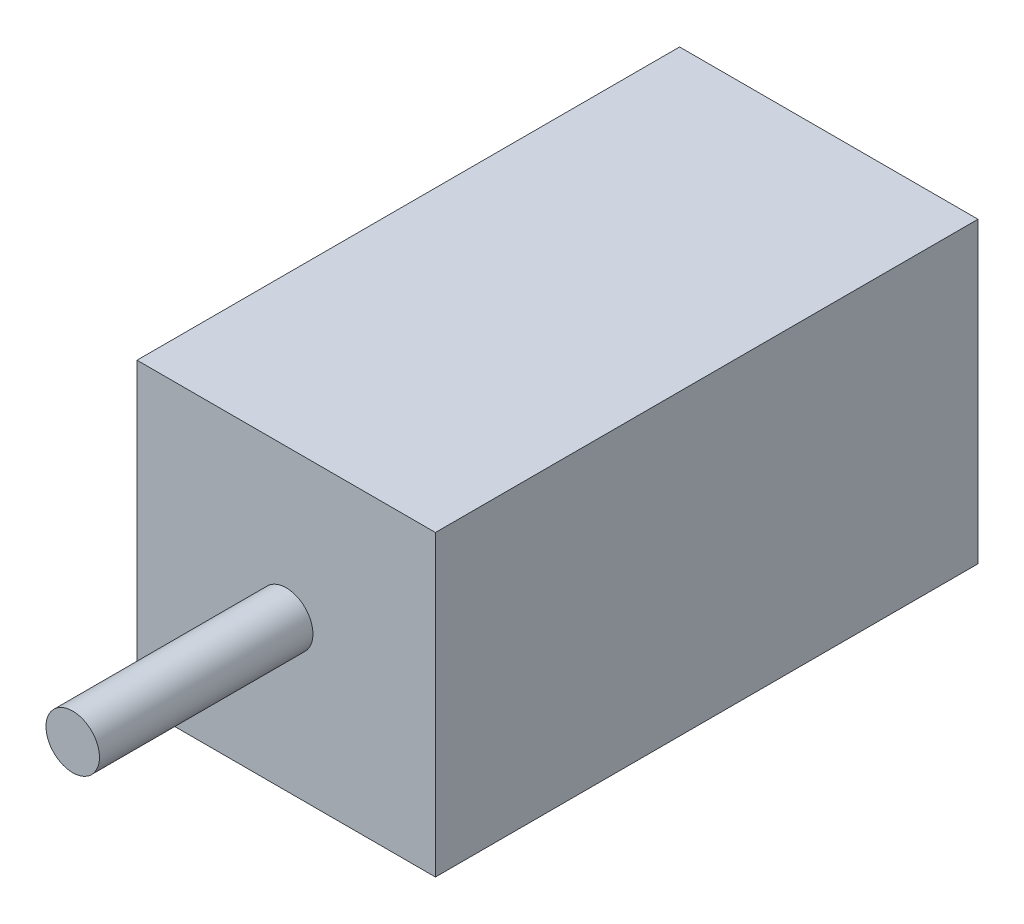
ISO-10303-21;
HEADER;
FILE_DESCRIPTION(('STEP AP214'),'2;1');
FILE_NAME('part.step','',(''),(''),'','','');
FILE_SCHEMA(('AUTOMOTIVE_DESIGN { 1 0 10303 214 1 1 1 1 }'));
ENDSEC;
DATA;
#1=APPLICATION_CONTEXT('core data for automotive mechanical design processes');
#2=APPLICATION_PROTOCOL_DEFINITION('international standard','automotive_design',2000,#1);
#3=PRODUCT_CONTEXT('',#1,'mechanical');
#4=PRODUCT('Part','Part','',(#3));
#5=PRODUCT_RELATED_PRODUCT_CATEGORY('part','',(#4));
#6=PRODUCT_DEFINITION_FORMATION('','',#4);
#7=PRODUCT_DEFINITION_CONTEXT('part definition',#1,'design');
#8=PRODUCT_DEFINITION('design','',#6,#7);
#9=PRODUCT_DEFINITION_SHAPE('','',#8);
#10=(LENGTH_UNIT() NAMED_UNIT(*) SI_UNIT(.MILLI.,.METRE.));
#11=(NAMED_UNIT(*) PLANE_ANGLE_UNIT() SI_UNIT($,.RADIAN.));
#12=(NAMED_UNIT(*) SI_UNIT($,.STERADIAN.) SOLID_ANGLE_UNIT());
#13=UNCERTAINTY_MEASURE_WITH_UNIT(LENGTH_MEASURE(1.E-05),#10,'distance_accuracy_value','');
#14=(GEOMETRIC_REPRESENTATION_CONTEXT(3) GLOBAL_UNCERTAINTY_ASSIGNED_CONTEXT((#13)) GLOBAL_UNIT_ASSIGNED_CONTEXT((#10,
#11,#12)) REPRESENTATION_CONTEXT('',''));
#15=CARTESIAN_POINT('',(0.,0.,0.));
#16=DIRECTION('',(0.,0.,1.));
#17=DIRECTION('',(1.,0.,0.));
#18=AXIS2_PLACEMENT_3D('',#15,#16,#17);
#19=CARTESIAN_POINT('',(13.97,-13.97,50.8));
#20=DIRECTION('',(-1.,0.,0.));
#21=DIRECTION('',(0.,0.,1.));
#22=AXIS2_PLACEMENT_3D('',#19,#20,#21);
#23=PLANE('',#22);
#24=DIRECTION('',(0.,1.,0.));
#25=VECTOR('',#24,1.);
#26=CARTESIAN_POINT('',(13.97,-13.97,0.));
#27=LINE('',#26,#25);
#28=CARTESIAN_POINT('',(13.97,-13.97,0.));
#29=VERTEX_POINT('',#28);
#30=CARTESIAN_POINT('',(13.97,13.97,0.));
#31=VERTEX_POINT('',#30);
#32=EDGE_CURVE('E99',#29,#31,#27,.T.);
#33=ORIENTED_EDGE('',*,*,#32,.T.);
#34=DIRECTION('',(0.,0.,-1.));
#35=VECTOR('',#34,1.);
#36=CARTESIAN_POINT('',(13.97,13.97,50.8));
#37=LINE('',#36,#35);
#38=CARTESIAN_POINT('',(13.97,13.97,50.8));
#39=VERTEX_POINT('',#38);
#40=EDGE_CURVE('E41',#39,#31,#37,.T.);
#41=ORIENTED_EDGE('',*,*,#40,.F.);
#42=DIRECTION('',(0.,1.,0.));
#43=VECTOR('',#42,1.);
#44=CARTESIAN_POINT('',(13.97,-13.97,50.8));
#45=LINE('',#44,#43);
#46=CARTESIAN_POINT('',(13.97,-13.97,50.8));
#47=VERTEX_POINT('',#46);
#48=EDGE_CURVE('E85',#47,#39,#45,.T.);
#49=ORIENTED_EDGE('',*,*,#48,.F.);
#50=DIRECTION('',(0.,0.,-1.));
#51=VECTOR('',#50,1.);
#52=CARTESIAN_POINT('',(13.97,-13.97,50.8));
#53=LINE('',#52,#51);
#54=EDGE_CURVE('E95',#47,#29,#53,.T.);
#55=ORIENTED_EDGE('',*,*,#54,.T.);
#56=EDGE_LOOP('',(#33,#41,#49,#55));
#57=FACE_BOUND('',#56,.T.);
#58=ADVANCED_FACE('F33',(#57),#23,.F.);
#59=CARTESIAN_POINT('',(-13.97,13.97,50.8));
#60=DIRECTION('',(0.,-1.,0.));
#61=DIRECTION('',(0.,0.,-1.));
#62=AXIS2_PLACEMENT_3D('',#59,#60,#61);
#63=PLANE('',#62);
#64=DIRECTION('',(-1.,0.,0.));
#65=VECTOR('',#64,1.);
#66=CARTESIAN_POINT('',(-13.97,13.97,0.));
#67=LINE('',#66,#65);
#68=CARTESIAN_POINT('',(-13.97,13.97,0.));
#69=VERTEX_POINT('',#68);
#70=EDGE_CURVE('E90',#31,#69,#67,.T.);
#71=ORIENTED_EDGE('',*,*,#70,.T.);
#72=DIRECTION('',(0.,0.,-1.));
#73=VECTOR('',#72,1.);
#74=CARTESIAN_POINT('',(-13.97,13.97,50.8));
#75=LINE('',#74,#73);
#76=CARTESIAN_POINT('',(-13.97,13.97,50.8));
#77=VERTEX_POINT('',#76);
#78=EDGE_CURVE('E88',#77,#69,#75,.T.);
#79=ORIENTED_EDGE('',*,*,#78,.F.);
#80=DIRECTION('',(-1.,0.,0.));
#81=VECTOR('',#80,1.);
#82=CARTESIAN_POINT('',(-13.97,13.97,50.8));
#83=LINE('',#82,#81);
#84=EDGE_CURVE('E80',#39,#77,#83,.T.);
#85=ORIENTED_EDGE('',*,*,#84,.F.);
#86=ORIENTED_EDGE('',*,*,#40,.T.);
#87=EDGE_LOOP('',(#71,#79,#85,#86));
#88=FACE_BOUND('',#87,.T.);
#89=ADVANCED_FACE('F89',(#88),#63,.F.);
#90=CARTESIAN_POINT('',(-13.97,-13.97,50.8));
#91=DIRECTION('',(1.,0.,0.));
#92=DIRECTION('',(0.,0.,-1.));
#93=AXIS2_PLACEMENT_3D('',#90,#91,#92);
#94=PLANE('',#93);
#95=DIRECTION('',(0.,-1.,0.));
#96=VECTOR('',#95,1.);
#97=CARTESIAN_POINT('',(-13.97,-13.97,0.));
#98=LINE('',#97,#96);
#99=CARTESIAN_POINT('',(-13.97,-13.97,0.));
#100=VERTEX_POINT('',#99);
#101=EDGE_CURVE('E66',#69,#100,#98,.T.);
#102=ORIENTED_EDGE('',*,*,#101,.T.);
#103=DIRECTION('',(0.,0.,-1.));
#104=VECTOR('',#103,1.);
#105=CARTESIAN_POINT('',(-13.97,-13.97,50.8));
#106=LINE('',#105,#104);
#107=CARTESIAN_POINT('',(-13.97,-13.97,50.8));
#108=VERTEX_POINT('',#107);
#109=EDGE_CURVE('E91',#108,#100,#106,.T.);
#110=ORIENTED_EDGE('',*,*,#109,.F.);
#111=DIRECTION('',(0.,-1.,0.));
#112=VECTOR('',#111,1.);
#113=CARTESIAN_POINT('',(-13.97,-13.97,50.8));
#114=LINE('',#113,#112);
#115=EDGE_CURVE('E83',#77,#108,#114,.T.);
#116=ORIENTED_EDGE('',*,*,#115,.F.);
#117=ORIENTED_EDGE('',*,*,#78,.T.);
#118=EDGE_LOOP('',(#102,#110,#116,#117));
#119=FACE_BOUND('',#118,.T.);
#120=ADVANCED_FACE('F93',(#119),#94,.F.);
#121=CARTESIAN_POINT('',(-13.97,-13.97,50.8));
#122=DIRECTION('',(0.,1.,0.));
#123=DIRECTION('',(0.,0.,1.));
#124=AXIS2_PLACEMENT_3D('',#121,#122,#123);
#125=PLANE('',#124);
#126=DIRECTION('',(1.,0.,0.));
#127=VECTOR('',#126,1.);
#128=CARTESIAN_POINT('',(-13.97,-13.97,0.));
#129=LINE('',#128,#127);
#130=EDGE_CURVE('E72',#100,#29,#129,.T.);
#131=ORIENTED_EDGE('',*,*,#130,.T.);
#132=ORIENTED_EDGE('',*,*,#54,.F.);
#133=DIRECTION('',(1.,0.,0.));
#134=VECTOR('',#133,1.);
#135=CARTESIAN_POINT('',(-13.97,-13.97,50.8));
#136=LINE('',#135,#134);
#137=EDGE_CURVE('E49',#108,#47,#136,.T.);
#138=ORIENTED_EDGE('',*,*,#137,.F.);
#139=ORIENTED_EDGE('',*,*,#109,.T.);
#140=EDGE_LOOP('',(#131,#132,#138,#139));
#141=FACE_BOUND('',#140,.T.);
#142=ADVANCED_FACE('F121',(#141),#125,.F.);
#143=CARTESIAN_POINT('',(0.,0.,50.8));
#144=DIRECTION('',(0.,0.,-1.));
#145=DIRECTION('',(-1.,0.,0.));
#146=AXIS2_PLACEMENT_3D('',#143,#144,#145);
#147=PLANE('',#146);
#148=CARTESIAN_POINT('',(0.,0.,50.8));
#149=DIRECTION('',(0.,0.,-1.));
#150=DIRECTION('',(-1.,0.,0.));
#151=AXIS2_PLACEMENT_3D('',#148,#149,#150);
#152=CIRCLE('',#151,2.5019);
#153=CARTESIAN_POINT('',(-2.5019,0.,50.8));
#154=VERTEX_POINT('',#153);
#155=EDGE_CURVE('E11',#154,#154,#152,.F.);
#156=ORIENTED_EDGE('',*,*,#155,.F.);
#157=EDGE_LOOP('',(#156));
#158=FACE_BOUND('',#157,.T.);
#159=ORIENTED_EDGE('',*,*,#48,.T.);
#160=ORIENTED_EDGE('',*,*,#84,.T.);
#161=ORIENTED_EDGE('',*,*,#115,.T.);
#162=ORIENTED_EDGE('',*,*,#137,.T.);
#163=EDGE_LOOP('',(#159,#160,#161,#162));
#164=FACE_BOUND('',#163,.T.);
#165=ADVANCED_FACE('F81',(#158,#164),#147,.F.);
#166=CARTESIAN_POINT('',(0.,0.,0.));
#167=DIRECTION('',(0.,0.,-1.));
#168=DIRECTION('',(-1.,0.,0.));
#169=AXIS2_PLACEMENT_3D('',#166,#167,#168);
#170=PLANE('',#169);
#171=ORIENTED_EDGE('',*,*,#32,.F.);
#172=ORIENTED_EDGE('',*,*,#130,.F.);
#173=ORIENTED_EDGE('',*,*,#101,.F.);
#174=ORIENTED_EDGE('',*,*,#70,.F.);
#175=EDGE_LOOP('',(#171,#172,#173,#174));
#176=FACE_BOUND('',#175,.T.);
#177=ADVANCED_FACE('F110',(#176),#170,.T.);
#178=CARTESIAN_POINT('',(0.,0.,70.7898));
#179=DIRECTION('',(0.,0.,-1.));
#180=DIRECTION('',(-1.,0.,0.));
#181=AXIS2_PLACEMENT_3D('',#178,#179,#180);
#182=CYLINDRICAL_SURFACE('',#181,2.5019);
#183=CARTESIAN_POINT('',(0.,0.,70.7898));
#184=DIRECTION('',(0.,0.,1.));
#185=DIRECTION('',(1.,0.,0.));
#186=AXIS2_PLACEMENT_3D('',#183,#184,#185);
#187=CIRCLE('',#186,2.5019);
#188=CARTESIAN_POINT('',(2.5019,0.,70.7898));
#189=VERTEX_POINT('',#188);
#190=EDGE_CURVE('E102',#189,#189,#187,.T.);
#191=ORIENTED_EDGE('',*,*,#190,.F.);
#192=EDGE_LOOP('',(#191));
#193=FACE_BOUND('',#192,.T.);
#194=ORIENTED_EDGE('',*,*,#155,.T.);
#195=EDGE_LOOP('',(#194));
#196=FACE_BOUND('',#195,.T.);
#197=ADVANCED_FACE('F112',(#193,#196),#182,.T.);
#198=CARTESIAN_POINT('',(0.,0.,70.7898));
#199=DIRECTION('',(0.,0.,1.));
#200=DIRECTION('',(1.,0.,0.));
#201=AXIS2_PLACEMENT_3D('',#198,#199,#200);
#202=PLANE('',#201);
#203=ORIENTED_EDGE('',*,*,#190,.T.);
#204=EDGE_LOOP('',(#203));
#205=FACE_BOUND('',#204,.T.);
#206=ADVANCED_FACE('F118',(#205),#202,.T.);
#207=CLOSED_SHELL('',(#58,#89,#120,#142,#165,#177,#197,#206));
#208=MANIFOLD_SOLID_BREP('B2',#207);
#209=ADVANCED_BREP_SHAPE_REPRESENTATION('',(#18,#208),#14);
#210=SHAPE_DEFINITION_REPRESENTATION(#9,#209);
ENDSEC;
END-ISO-10303-21;
